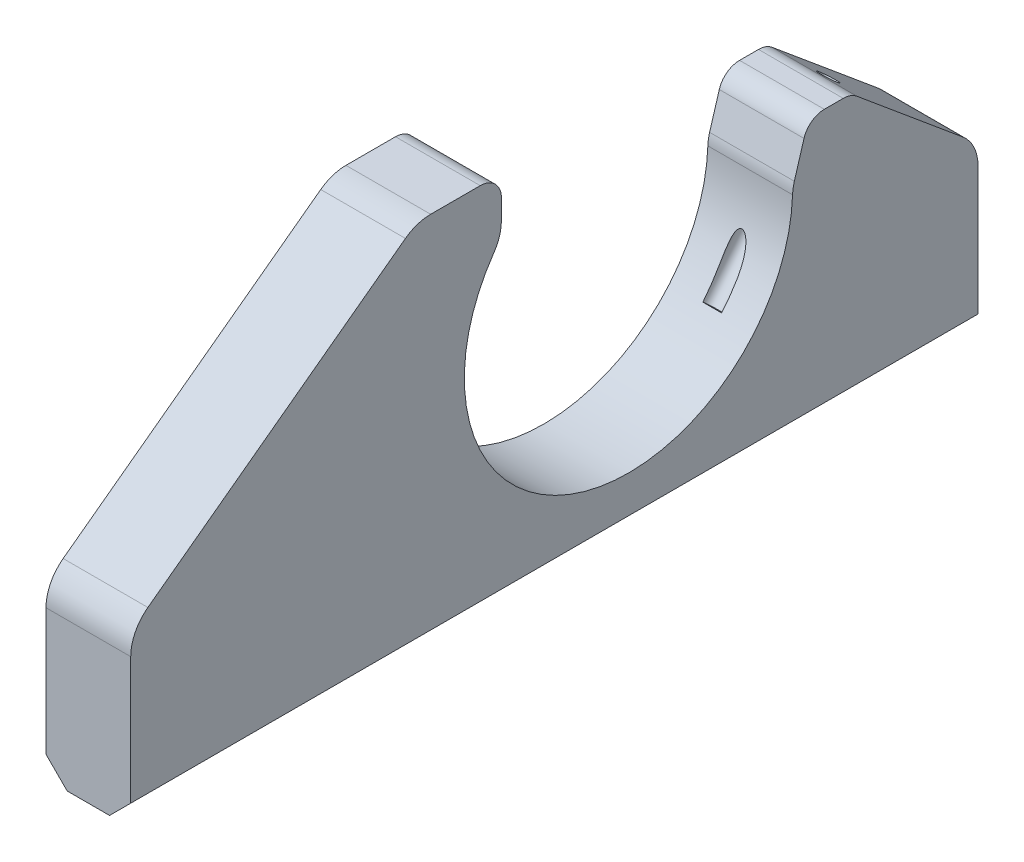
ISO-10303-21;
HEADER;
FILE_DESCRIPTION(('STEP AP214'),'2;1');
FILE_NAME('part.step','',(''),(''),'','','');
FILE_SCHEMA(('AUTOMOTIVE_DESIGN { 1 0 10303 214 1 1 1 1 }'));
ENDSEC;
DATA;
#1=APPLICATION_CONTEXT('core data for automotive mechanical design processes');
#2=APPLICATION_PROTOCOL_DEFINITION('international standard','automotive_design',2000,#1);
#3=PRODUCT_CONTEXT('',#1,'mechanical');
#4=PRODUCT('Part','Part','',(#3));
#5=PRODUCT_RELATED_PRODUCT_CATEGORY('part','',(#4));
#6=PRODUCT_DEFINITION_FORMATION('','',#4);
#7=PRODUCT_DEFINITION_CONTEXT('part definition',#1,'design');
#8=PRODUCT_DEFINITION('design','',#6,#7);
#9=PRODUCT_DEFINITION_SHAPE('','',#8);
#10=(LENGTH_UNIT() NAMED_UNIT(*) SI_UNIT(.MILLI.,.METRE.));
#11=(NAMED_UNIT(*) PLANE_ANGLE_UNIT() SI_UNIT($,.RADIAN.));
#12=(NAMED_UNIT(*) SI_UNIT($,.STERADIAN.) SOLID_ANGLE_UNIT());
#13=UNCERTAINTY_MEASURE_WITH_UNIT(LENGTH_MEASURE(1.E-05),#10,'distance_accuracy_value','');
#14=(GEOMETRIC_REPRESENTATION_CONTEXT(3) GLOBAL_UNCERTAINTY_ASSIGNED_CONTEXT((#13)) GLOBAL_UNIT_ASSIGNED_CONTEXT((#10,
#11,#12)) REPRESENTATION_CONTEXT('',''));
#15=CARTESIAN_POINT('',(0.,0.,0.));
#16=DIRECTION('',(0.,0.,1.));
#17=DIRECTION('',(1.,0.,0.));
#18=AXIS2_PLACEMENT_3D('',#15,#16,#17);
#19=CARTESIAN_POINT('',(20.,-25.,-165.));
#20=DIRECTION('',(0.,-0.768221279597376,0.64018439966448));
#21=DIRECTION('',(0.,-0.64018439966448,-0.768221279597376));
#22=AXIS2_PLACEMENT_3D('',#19,#20,#21);
#23=PLANE('',#22);
#24=DIRECTION('',(0.,0.64018439966448,0.768221279597376));
#25=VECTOR('',#24,1.);
#26=CARTESIAN_POINT('',(20.,-25.,-165.));
#27=LINE('',#26,#25);
#28=CARTESIAN_POINT('',(20.,-19.0030733277413,-157.80368799329));
#29=VERTEX_POINT('',#28);
#30=CARTESIAN_POINT('',(20.,22.6822127959738,-107.781344644831));
#31=VERTEX_POINT('',#30);
#32=EDGE_CURVE('E359',#29,#31,#27,.T.);
#33=ORIENTED_EDGE('',*,*,#32,.F.);
#34=DIRECTION('',(-1.,0.,0.));
#35=VECTOR('',#34,1.);
#36=CARTESIAN_POINT('',(20.,-19.0030733277413,-157.80368799329));
#37=LINE('',#36,#35);
#38=CARTESIAN_POINT('',(-20.,-19.0030733277413,-157.80368799329));
#39=VERTEX_POINT('',#38);
#40=EDGE_CURVE('E279',#29,#39,#37,.T.);
#41=ORIENTED_EDGE('',*,*,#40,.T.);
#42=DIRECTION('',(0.,0.64018439966448,0.768221279597376));
#43=VECTOR('',#42,1.);
#44=CARTESIAN_POINT('',(-20.,-25.,-165.));
#45=LINE('',#44,#43);
#46=CARTESIAN_POINT('',(-20.,22.6822127959738,-107.781344644831));
#47=VERTEX_POINT('',#46);
#48=EDGE_CURVE('E315',#39,#47,#45,.T.);
#49=ORIENTED_EDGE('',*,*,#48,.T.);
#50=DIRECTION('',(-1.,0.,0.));
#51=VECTOR('',#50,1.);
#52=CARTESIAN_POINT('',(20.,22.6822127959738,-107.781344644831));
#53=LINE('',#52,#51);
#54=EDGE_CURVE('E234',#47,#31,#53,.F.);
#55=ORIENTED_EDGE('',*,*,#54,.T.);
#56=EDGE_LOOP('',(#33,#41,#49,#55));
#57=FACE_BOUND('',#56,.T.);
#58=CARTESIAN_POINT('',(0.,17.3177872040262,-114.218655355169));
#59=DIRECTION('',(0.,0.768221279597376,-0.64018439966448));
#60=DIRECTION('',(0.,0.64018439966448,0.768221279597376));
#61=AXIS2_PLACEMENT_3D('',#58,#59,#60);
#62=CIRCLE('',#61,4.49999999999999);
#63=CARTESIAN_POINT('',(0.,20.1986170025164,-110.76165959698));
#64=VERTEX_POINT('',#63);
#65=EDGE_CURVE('E196',#64,#64,#62,.T.);
#66=ORIENTED_EDGE('',*,*,#65,.F.);
#67=EDGE_LOOP('',(#66));
#68=FACE_BOUND('',#67,.T.);
#69=ADVANCED_FACE('F36',(#57,#68),#23,.F.);
#70=CARTESIAN_POINT('',(20.,-105.,235.));
#71=DIRECTION('',(0.,0.,-1.));
#72=DIRECTION('',(-1.,0.,0.));
#73=AXIS2_PLACEMENT_3D('',#70,#71,#72);
#74=PLANE('',#73);
#75=DIRECTION('',(0.,-1.,0.));
#76=VECTOR('',#75,1.);
#77=CARTESIAN_POINT('',(-20.,-105.,235.));
#78=LINE('',#77,#76);
#79=CARTESIAN_POINT('',(-20.,-35.0745149872762,235.));
#80=VERTEX_POINT('',#79);
#81=CARTESIAN_POINT('',(-20.,-94.9999999999999,235.));
#82=VERTEX_POINT('',#81);
#83=EDGE_CURVE('E195',#80,#82,#78,.T.);
#84=ORIENTED_EDGE('',*,*,#83,.T.);
#85=DIRECTION('',(-0.707106781186546,0.707106781186549,0.));
#86=VECTOR('',#85,1.);
#87=CARTESIAN_POINT('',(-9.99999999999993,-105.,235.));
#88=LINE('',#87,#86);
#89=CARTESIAN_POINT('',(-9.99999999999993,-105.,235.));
#90=VERTEX_POINT('',#89);
#91=EDGE_CURVE('E44',#82,#90,#88,.F.);
#92=ORIENTED_EDGE('',*,*,#91,.T.);
#93=DIRECTION('',(-1.,0.,0.));
#94=VECTOR('',#93,1.);
#95=CARTESIAN_POINT('',(20.,-105.,235.));
#96=LINE('',#95,#94);
#97=CARTESIAN_POINT('',(9.99999999999993,-105.,235.));
#98=VERTEX_POINT('',#97);
#99=EDGE_CURVE('E191',#98,#90,#96,.T.);
#100=ORIENTED_EDGE('',*,*,#99,.F.);
#101=DIRECTION('',(0.707106781186549,0.707106781186546,0.));
#102=VECTOR('',#101,1.);
#103=CARTESIAN_POINT('',(20.,-95.,235.));
#104=LINE('',#103,#102);
#105=CARTESIAN_POINT('',(20.,-95.,235.));
#106=VERTEX_POINT('',#105);
#107=EDGE_CURVE('E51',#98,#106,#104,.T.);
#108=ORIENTED_EDGE('',*,*,#107,.T.);
#109=DIRECTION('',(0.,-1.,0.));
#110=VECTOR('',#109,1.);
#111=CARTESIAN_POINT('',(20.,-105.,235.));
#112=LINE('',#111,#110);
#113=CARTESIAN_POINT('',(20.,-35.0745149872762,235.));
#114=VERTEX_POINT('',#113);
#115=EDGE_CURVE('E338',#114,#106,#112,.T.);
#116=ORIENTED_EDGE('',*,*,#115,.F.);
#117=DIRECTION('',(-1.,0.,0.));
#118=VECTOR('',#117,1.);
#119=CARTESIAN_POINT('',(20.,-35.0745149872762,235.));
#120=LINE('',#119,#118);
#121=EDGE_CURVE('E240',#114,#80,#120,.T.);
#122=ORIENTED_EDGE('',*,*,#121,.T.);
#123=EDGE_LOOP('',(#84,#92,#100,#108,#116,#122));
#124=FACE_BOUND('',#123,.T.);
#125=ADVANCED_FACE('F299',(#124),#74,.F.);
#126=CARTESIAN_POINT('',(20.,-105.,235.));
#127=DIRECTION('',(0.,1.,0.));
#128=DIRECTION('',(0.,0.,1.));
#129=AXIS2_PLACEMENT_3D('',#126,#127,#128);
#130=PLANE('',#129);
#131=ORIENTED_EDGE('',*,*,#99,.T.);
#132=DIRECTION('',(0.,0.,-1.));
#133=VECTOR('',#132,1.);
#134=CARTESIAN_POINT('',(-9.99999999999993,-105.,235.));
#135=LINE('',#134,#133);
#136=CARTESIAN_POINT('',(-9.99999999999993,-105.,-165.));
#137=VERTEX_POINT('',#136);
#138=EDGE_CURVE('E289',#90,#137,#135,.T.);
#139=ORIENTED_EDGE('',*,*,#138,.T.);
#140=DIRECTION('',(-1.,0.,0.));
#141=VECTOR('',#140,1.);
#142=CARTESIAN_POINT('',(20.,-105.,-165.));
#143=LINE('',#142,#141);
#144=CARTESIAN_POINT('',(9.99999999999993,-105.,-165.));
#145=VERTEX_POINT('',#144);
#146=EDGE_CURVE('E307',#145,#137,#143,.T.);
#147=ORIENTED_EDGE('',*,*,#146,.F.);
#148=DIRECTION('',(0.,0.,1.));
#149=VECTOR('',#148,1.);
#150=CARTESIAN_POINT('',(9.99999999999993,-105.,235.));
#151=LINE('',#150,#149);
#152=EDGE_CURVE('E287',#145,#98,#151,.T.);
#153=ORIENTED_EDGE('',*,*,#152,.T.);
#154=EDGE_LOOP('',(#131,#139,#147,#153));
#155=FACE_BOUND('',#154,.T.);
#156=ADVANCED_FACE('F303',(#155),#130,.F.);
#157=CARTESIAN_POINT('',(20.,-105.,-165.));
#158=DIRECTION('',(0.,0.,1.));
#159=DIRECTION('',(0.,-1.,0.));
#160=AXIS2_PLACEMENT_3D('',#157,#158,#159);
#161=PLANE('',#160);
#162=ORIENTED_EDGE('',*,*,#146,.T.);
#163=DIRECTION('',(0.707106781186546,-0.707106781186549,0.));
#164=VECTOR('',#163,1.);
#165=CARTESIAN_POINT('',(-10.,-105.,-165.));
#166=LINE('',#165,#164);
#167=CARTESIAN_POINT('',(-20.,-94.9999999999999,-165.));
#168=VERTEX_POINT('',#167);
#169=EDGE_CURVE('E294',#137,#168,#166,.F.);
#170=ORIENTED_EDGE('',*,*,#169,.T.);
#171=DIRECTION('',(0.,1.,0.));
#172=VECTOR('',#171,1.);
#173=CARTESIAN_POINT('',(-20.,-105.,-165.));
#174=LINE('',#173,#172);
#175=CARTESIAN_POINT('',(-20.,-34.3674989196888,-165.));
#176=VERTEX_POINT('',#175);
#177=EDGE_CURVE('E311',#168,#176,#174,.T.);
#178=ORIENTED_EDGE('',*,*,#177,.T.);
#179=DIRECTION('',(-1.,0.,0.));
#180=VECTOR('',#179,1.);
#181=CARTESIAN_POINT('',(20.,-34.3674989196888,-165.));
#182=LINE('',#181,#180);
#183=CARTESIAN_POINT('',(20.,-34.3674989196888,-165.));
#184=VERTEX_POINT('',#183);
#185=EDGE_CURVE('E282',#176,#184,#182,.F.);
#186=ORIENTED_EDGE('',*,*,#185,.T.);
#187=DIRECTION('',(0.,1.,0.));
#188=VECTOR('',#187,1.);
#189=CARTESIAN_POINT('',(20.,-105.,-165.));
#190=LINE('',#189,#188);
#191=CARTESIAN_POINT('',(20.,-95.,-165.));
#192=VERTEX_POINT('',#191);
#193=EDGE_CURVE('E361',#192,#184,#190,.T.);
#194=ORIENTED_EDGE('',*,*,#193,.F.);
#195=DIRECTION('',(-0.707106781186549,-0.707106781186546,0.));
#196=VECTOR('',#195,1.);
#197=CARTESIAN_POINT('',(20.,-95.,-165.));
#198=LINE('',#197,#196);
#199=EDGE_CURVE('E292',#192,#145,#198,.T.);
#200=ORIENTED_EDGE('',*,*,#199,.T.);
#201=EDGE_LOOP('',(#162,#170,#178,#186,#194,#200));
#202=FACE_BOUND('',#201,.T.);
#203=ADVANCED_FACE('F310',(#202),#161,.F.);
#204=CARTESIAN_POINT('',(20.,25.,-105.));
#205=DIRECTION('',(0.,-1.,0.));
#206=DIRECTION('',(0.,0.,-1.));
#207=AXIS2_PLACEMENT_3D('',#204,#205,#206);
#208=PLANE('',#207);
#209=DIRECTION('',(0.,0.,1.));
#210=VECTOR('',#209,1.);
#211=CARTESIAN_POINT('',(20.,25.,-105.));
#212=LINE('',#211,#210);
#213=CARTESIAN_POINT('',(20.,25.,-101.379500648187));
#214=VERTEX_POINT('',#213);
#215=CARTESIAN_POINT('',(20.,25.,-92.4403065089106));
#216=VERTEX_POINT('',#215);
#217=EDGE_CURVE('E356',#214,#216,#212,.T.);
#218=ORIENTED_EDGE('',*,*,#217,.F.);
#219=DIRECTION('',(-1.,0.,0.));
#220=VECTOR('',#219,1.);
#221=CARTESIAN_POINT('',(20.,25.,-101.379500648187));
#222=LINE('',#221,#220);
#223=CARTESIAN_POINT('',(-20.,25.,-101.379500648187));
#224=VERTEX_POINT('',#223);
#225=EDGE_CURVE('E231',#214,#224,#222,.T.);
#226=ORIENTED_EDGE('',*,*,#225,.T.);
#227=DIRECTION('',(0.,0.,1.));
#228=VECTOR('',#227,1.);
#229=CARTESIAN_POINT('',(-20.,25.,-105.));
#230=LINE('',#229,#228);
#231=CARTESIAN_POINT('',(-20.,25.,-92.4403065089106));
#232=VERTEX_POINT('',#231);
#233=EDGE_CURVE('E317',#224,#232,#230,.T.);
#234=ORIENTED_EDGE('',*,*,#233,.T.);
#235=DIRECTION('',(-1.,0.,0.));
#236=VECTOR('',#235,1.);
#237=CARTESIAN_POINT('',(20.,25.,-92.4403065089106));
#238=LINE('',#237,#236);
#239=EDGE_CURVE('E229',#232,#216,#238,.F.);
#240=ORIENTED_EDGE('',*,*,#239,.T.);
#241=EDGE_LOOP('',(#218,#226,#234,#240));
#242=FACE_BOUND('',#241,.T.);
#243=ADVANCED_FACE('F377',(#242),#208,.F.);
#244=CARTESIAN_POINT('',(20.,25.,-85.));
#245=DIRECTION('',(0.,-0.287347885566346,-0.957826285221151));
#246=DIRECTION('',(0.,0.957826285221151,-0.287347885566346));
#247=AXIS2_PLACEMENT_3D('',#244,#245,#246);
#248=PLANE('',#247);
#249=DIRECTION('',(0.,-0.957826285221151,0.287347885566346));
#250=VECTOR('',#249,1.);
#251=CARTESIAN_POINT('',(-20.,25.,-85.));
#252=LINE('',#251,#250);
#253=CARTESIAN_POINT('',(-20.,17.8734788556635,-82.8620436566991));
#254=VERTEX_POINT('',#253);
#255=CARTESIAN_POINT('',(-20.,2.64730250173201,-78.2941907505197));
#256=VERTEX_POINT('',#255);
#257=EDGE_CURVE('E324',#254,#256,#252,.T.);
#258=ORIENTED_EDGE('',*,*,#257,.T.);
#259=DIRECTION('',(-1.,0.,0.));
#260=VECTOR('',#259,1.);
#261=CARTESIAN_POINT('',(20.,2.64730250173201,-78.2941907505197));
#262=LINE('',#261,#260);
#263=CARTESIAN_POINT('',(20.,2.64730250173201,-78.2941907505197));
#264=VERTEX_POINT('',#263);
#265=EDGE_CURVE('E285',#256,#264,#262,.F.);
#266=ORIENTED_EDGE('',*,*,#265,.T.);
#267=DIRECTION('',(0.,-0.957826285221151,0.287347885566346));
#268=VECTOR('',#267,1.);
#269=CARTESIAN_POINT('',(20.,25.,-85.));
#270=LINE('',#269,#268);
#271=CARTESIAN_POINT('',(20.,17.8734788556635,-82.8620436566991));
#272=VERTEX_POINT('',#271);
#273=EDGE_CURVE('E353',#272,#264,#270,.T.);
#274=ORIENTED_EDGE('',*,*,#273,.F.);
#275=DIRECTION('',(-1.,0.,0.));
#276=VECTOR('',#275,1.);
#277=CARTESIAN_POINT('',(20.,17.8734788556635,-82.8620436566991));
#278=LINE('',#277,#276);
#279=EDGE_CURVE('E237',#272,#254,#278,.T.);
#280=ORIENTED_EDGE('',*,*,#279,.T.);
#281=EDGE_LOOP('',(#258,#266,#274,#280));
#282=FACE_BOUND('',#281,.T.);
#283=ADVANCED_FACE('F439',(#282),#248,.F.);
#284=CARTESIAN_POINT('',(20.,0.,0.));
#285=DIRECTION('',(-1.,0.,0.));
#286=DIRECTION('',(0.,0.,1.));
#287=AXIS2_PLACEMENT_3D('',#284,#285,#286);
#288=CYLINDRICAL_SURFACE('',#287,77.5);
#289=CARTESIAN_POINT('',(-4.42064328381064,-49.6142909739972,-59.5371491687966));
#290=CARTESIAN_POINT('',(-4.42063223439587,-49.3258877645143,-59.7774854526784));
#291=CARTESIAN_POINT('',(-4.42116218208857,-49.035738401147,-60.0157254754635));
#292=CARTESIAN_POINT('',(-4.42322373057201,-48.4520114345749,-60.4879617376993));
#293=CARTESIAN_POINT('',(-4.42475532825368,-48.1584338420141,-60.7219579903201));
#294=CARTESIAN_POINT('',(-4.42873982652362,-47.5679141763734,-61.1856557795448));
#295=CARTESIAN_POINT('',(-4.43119272248587,-47.2709721201944,-61.4153573377072));
#296=CARTESIAN_POINT('',(-4.43685740657448,-46.6737881794937,-61.8704164248569));
#297=CARTESIAN_POINT('',(-4.44006919546906,-46.3735462916319,-62.0957739494466));
#298=CARTESIAN_POINT('',(-4.45055441771913,-45.4665271708848,-62.7663225356267));
#299=CARTESIAN_POINT('',(-4.45866650432388,-44.8548484276277,-63.2048965388281));
#300=CARTESIAN_POINT('',(-4.47471513100481,-43.6189821836077,-64.064036421948));
#301=CARTESIAN_POINT('',(-4.48265167309289,-42.9947948263607,-64.4846025083045));
#302=CARTESIAN_POINT('',(-4.49244199680447,-41.9944458687961,-65.1376384983351));
#303=CARTESIAN_POINT('',(-4.4954544204643,-41.6222084905466,-65.3761209714467));
#304=CARTESIAN_POINT('',(-4.49942684946549,-40.8737012728814,-65.8466852487549));
#305=CARTESIAN_POINT('',(-4.50038688453548,-40.497431491954,-66.0787671456152));
#306=CARTESIAN_POINT('',(-4.4993247313951,-39.7408991935622,-66.536504557196));
#307=CARTESIAN_POINT('',(-4.49730192542122,-39.3606358652068,-66.7621587308314));
#308=CARTESIAN_POINT('',(-4.48921135393556,-38.5963428378235,-67.2069028897369));
#309=CARTESIAN_POINT('',(-4.48314370526273,-38.2123132479033,-67.425993064423));
#310=CARTESIAN_POINT('',(-4.46576056006467,-37.4409718701168,-67.8573409091116));
#311=CARTESIAN_POINT('',(-4.45444948101797,-37.0536631140066,-68.0696041699811));
#312=CARTESIAN_POINT('',(-4.42518953262511,-36.2756786880118,-68.4873715979512));
#313=CARTESIAN_POINT('',(-4.40724094982016,-35.8850031641816,-68.6928760564125));
#314=CARTESIAN_POINT('',(-4.3630831355172,-35.100693795009,-69.0969306320539));
#315=CARTESIAN_POINT('',(-4.33687674650837,-34.7070610130539,-69.2954831161401));
#316=CARTESIAN_POINT('',(-4.27425595592277,-33.9171351076044,-69.6855217255223));
#317=CARTESIAN_POINT('',(-4.23784238539796,-33.5208422032556,-69.8770084246672));
#318=CARTESIAN_POINT('',(-4.15233683212676,-32.725486280476,-70.2530167768276));
#319=CARTESIAN_POINT('',(-4.10322377420339,-32.3264197407404,-70.437526261888));
#320=CARTESIAN_POINT('',(-3.98927986073676,-31.5269091144921,-70.7989859935073));
#321=CARTESIAN_POINT('',(-3.92444503506321,-31.1264647052534,-70.9759343173919));
#322=CARTESIAN_POINT('',(-3.81230219005366,-30.5258301311945,-71.2353237361862));
#323=CARTESIAN_POINT('',(-3.77242373651436,-30.325557365319,-71.3208087823248));
#324=CARTESIAN_POINT('',(-3.6870300467838,-29.9253276471309,-71.4896630158568));
#325=CARTESIAN_POINT('',(-3.64151518618602,-29.725370674673,-71.5730323437897));
#326=CARTESIAN_POINT('',(-3.54408662312453,-29.3262016013118,-71.7375109241284));
#327=CARTESIAN_POINT('',(-3.4921761531379,-29.1269891761314,-71.8186212930505));
#328=CARTESIAN_POINT('',(-3.38097661076846,-28.7296920506679,-71.9784733835246));
#329=CARTESIAN_POINT('',(-3.32168846298377,-28.5316072123186,-72.0572154003545));
#330=CARTESIAN_POINT('',(-3.1941986448062,-28.1361864714919,-72.212535968651));
#331=CARTESIAN_POINT('',(-3.12595348472764,-27.938859398961,-72.2891015906295));
#332=CARTESIAN_POINT('',(-2.97918449326893,-27.5468367040748,-72.4393943179283));
#333=CARTESIAN_POINT('',(-2.90065711422824,-27.3521420156648,-72.5131204321223));
#334=CARTESIAN_POINT('',(-2.73161291245189,-26.9676597132034,-72.6569837246079));
#335=CARTESIAN_POINT('',(-2.64114552908005,-26.7778555262691,-72.7271341325125));
#336=CARTESIAN_POINT('',(-2.44529958480708,-26.4046985883348,-72.8634422728918));
#337=CARTESIAN_POINT('',(-2.33993533569647,-26.2213398537168,-72.929603751606));
#338=CARTESIAN_POINT('',(-2.14063803283769,-25.9116503175357,-73.0400978282845));
#339=CARTESIAN_POINT('',(-2.05098412014308,-25.7830017646701,-73.0855958045049));
#340=CARTESIAN_POINT('',(-1.85928891391285,-25.5334965624391,-73.173137265876));
#341=CARTESIAN_POINT('',(-1.75722775322377,-25.4126528972559,-73.2151750249587));
#342=CARTESIAN_POINT('',(-1.53731878644118,-25.1817869209003,-73.294901968513));
#343=CARTESIAN_POINT('',(-1.41931526037342,-25.0718927458815,-73.332540392752));
#344=CARTESIAN_POINT('',(-1.1660477176065,-24.871413764512,-73.4007759848755));
#345=CARTESIAN_POINT('',(-1.03084187689416,-24.7807665047605,-73.4313959531563));
#346=CARTESIAN_POINT('',(-0.797760367872305,-24.6580644005075,-73.4726640844761));
#347=CARTESIAN_POINT('',(-0.705307803265684,-24.6168473751052,-73.4864756915962));
#348=CARTESIAN_POINT('',(-0.514656583202884,-24.5488060353631,-73.5092335136322));
#349=CARTESIAN_POINT('',(-0.416464628317794,-24.5219652951911,-73.5181852813873));
#350=CARTESIAN_POINT('',(-0.21576141876568,-24.4851418936219,-73.5304578452407));
#351=CARTESIAN_POINT('',(-0.113223022066944,-24.4752888240691,-73.5337353555793));
#352=CARTESIAN_POINT('',(0.0919857178027263,-24.4740327969327,-73.5341534333862));
#353=CARTESIAN_POINT('',(0.194656054464323,-24.4826289616202,-73.5312942928076));
#354=CARTESIAN_POINT('',(0.387413653447475,-24.5156395854677,-73.5202942310873));
#355=CARTESIAN_POINT('',(0.477797930900007,-24.53854960752,-73.5126555548598));
#356=CARTESIAN_POINT('',(0.653954546438842,-24.5967777491929,-73.493193327242));
#357=CARTESIAN_POINT('',(0.739724517630437,-24.6321021680699,-73.4813676512808));
#358=CARTESIAN_POINT('',(0.952370468437,-24.7355644639345,-73.44662160153));
#359=CARTESIAN_POINT('',(1.07527272593243,-24.8109883202687,-73.4212004955392));
#360=CARTESIAN_POINT('',(1.30736343331986,-24.9787712797184,-73.3642887022988));
#361=CARTESIAN_POINT('',(1.4165098990431,-25.0711802092895,-73.3327801429592));
#362=CARTESIAN_POINT('',(1.61133221263475,-25.2568694266049,-73.2690190795921));
#363=CARTESIAN_POINT('',(1.69826977859667,-25.349001680386,-73.2372057619323));
#364=CARTESIAN_POINT('',(1.86353546297131,-25.5398483428752,-73.1708710075939));
#365=CARTESIAN_POINT('',(1.94185621077163,-25.6385682723426,-73.1363472950999));
#366=CARTESIAN_POINT('',(2.09111592409917,-25.8409418947543,-73.065089199301));
#367=CARTESIAN_POINT('',(2.16204054574754,-25.9446046266916,-73.0283507306716));
#368=CARTESIAN_POINT('',(2.29731278830659,-26.155432598979,-72.9531074107178));
#369=CARTESIAN_POINT('',(2.36166250030271,-26.2625967113493,-72.9146031266738));
#370=CARTESIAN_POINT('',(2.51004692606179,-26.5243911400148,-72.8198683111174));
#371=CARTESIAN_POINT('',(2.59124188993133,-26.680353984949,-72.7628817805031));
#372=CARTESIAN_POINT('',(2.74413924458365,-26.9959793581916,-72.6463725291208));
#373=CARTESIAN_POINT('',(2.81583724529767,-27.1556435576959,-72.5868486521272));
#374=CARTESIAN_POINT('',(2.95124781967097,-27.4777856330088,-72.4655157372496));
#375=CARTESIAN_POINT('',(3.01494741109696,-27.6402676081256,-72.4037031898794));
#376=CARTESIAN_POINT('',(3.13536568885489,-27.9670508090521,-72.2781067879273));
#377=CARTESIAN_POINT('',(3.19208360285012,-28.1313522339482,-72.2143227162234));
#378=CARTESIAN_POINT('',(3.29970069419957,-28.4620342676637,-72.084632945551));
#379=CARTESIAN_POINT('',(3.35056967098492,-28.6284211432217,-72.0187183055068));
#380=CARTESIAN_POINT('',(3.44690872117865,-28.9620715840066,-71.8851911182319));
#381=CARTESIAN_POINT('',(3.49237864364425,-29.1293351736076,-71.817578523595));
#382=CARTESIAN_POINT('',(3.57848780028409,-29.4642574026028,-71.6808218474475));
#383=CARTESIAN_POINT('',(3.61913204127896,-29.6319154451917,-71.6116794431449));
#384=CARTESIAN_POINT('',(3.69615566995861,-29.9675681783944,-71.4718680100906));
#385=CARTESIAN_POINT('',(3.73253505843603,-30.1355628689456,-71.4011989816227));
#386=CARTESIAN_POINT('',(3.82451390584329,-30.5840679871616,-71.2106564417144));
#387=CARTESIAN_POINT('',(3.87670506446749,-30.8647225150642,-71.0894700211783));
#388=CARTESIAN_POINT('',(3.97211581489585,-31.4258618554054,-70.8432009844557));
#389=CARTESIAN_POINT('',(4.01533434483514,-31.7063466438442,-70.7181179091321));
#390=CARTESIAN_POINT('',(4.09413348033107,-32.2668190812362,-70.4641545868399));
#391=CARTESIAN_POINT('',(4.12971057798387,-32.5468064435983,-70.3352726266838));
#392=CARTESIAN_POINT('',(4.19428298811875,-33.1058298084767,-70.0738843152767));
#393=CARTESIAN_POINT('',(4.22327839146182,-33.384865824074,-69.9413780140885));
#394=CARTESIAN_POINT('',(4.30189835684308,-34.2212881679405,-69.5380259330145));
#395=CARTESIAN_POINT('',(4.34301254733638,-34.776908817833,-69.2618361377995));
#396=CARTESIAN_POINT('',(4.40844650311766,-35.8821315202024,-68.6957661120846));
#397=CARTESIAN_POINT('',(4.43276450758109,-36.4317329357119,-68.4058844496031));
#398=CARTESIAN_POINT('',(4.45998787844411,-37.2512546481019,-67.9609504928667));
#399=CARTESIAN_POINT('',(4.46752148021818,-37.5237472483344,-67.8108780419466));
#400=CARTESIAN_POINT('',(4.47996051560985,-38.0669301750118,-67.5074484577572));
#401=CARTESIAN_POINT('',(4.48486615252194,-38.3376206392663,-67.3540915795197));
#402=CARTESIAN_POINT('',(4.49630633889271,-39.1469692837208,-66.8891023893294));
#403=CARTESIAN_POINT('',(4.49956308666402,-39.6828687151031,-66.5725710669871));
#404=CARTESIAN_POINT('',(4.50035360453184,-40.7462934703357,-65.927051085498));
#405=CARTESIAN_POINT('',(4.49789362189735,-41.273827301764,-65.598076411036));
#406=CARTESIAN_POINT('',(4.4897584139022,-42.3207841496757,-64.9275568426811));
#407=CARTESIAN_POINT('',(4.4840833315845,-42.840207525945,-64.5860125086567));
#408=CARTESIAN_POINT('',(4.47126543670978,-43.8976034067932,-63.8723589959792));
#409=CARTESIAN_POINT('',(4.46406142147072,-44.4351267546988,-63.4995852832483));
#410=CARTESIAN_POINT('',(4.45030979887536,-45.5006366600443,-62.7404973332324));
#411=CARTESIAN_POINT('',(4.44376227645029,-46.028621976313,-62.3541813526711));
#412=CARTESIAN_POINT('',(4.43275550433862,-47.0721770579917,-61.5701553572331));
#413=CARTESIAN_POINT('',(4.42828647927339,-47.5877938985186,-61.1725082086148));
#414=CARTESIAN_POINT('',(4.42374091239954,-48.3535477303723,-60.5664130327498));
#415=CARTESIAN_POINT('',(4.42258538885685,-48.6075086116865,-60.3627870856597));
#416=CARTESIAN_POINT('',(4.42103422928401,-49.1128466943491,-59.952349779417));
#417=CARTESIAN_POINT('',(4.42063859544708,-49.3642238882385,-59.7455384110723));
#418=CARTESIAN_POINT('',(4.42064328381067,-49.6142909739972,-59.5371491687966));
#419=B_SPLINE_CURVE_WITH_KNOTS('',3,(#289,#290,#291,#292,#293,#294,#295,#296,#297,#298,#299,
#300,#301,#302,#303,#304,#305,#306,#307,#308,#309,#310,#311,#312,#313,#314,#315,#316,#317,#318,
#319,#320,#321,#322,#323,#324,#325,#326,#327,#328,#329,#330,#331,#332,#333,#334,#335,#336,#337,
#338,#339,#340,#341,#342,#343,#344,#345,#346,#347,#348,#349,#350,#351,#352,#353,#354,#355,#356,
#357,#358,#359,#360,#361,#362,#363,#364,#365,#366,#367,#368,#369,#370,#371,#372,#373,#374,#375,
#376,#377,#378,#379,#380,#381,#382,#383,#384,#385,#386,#387,#388,#389,#390,#391,#392,#393,#394,
#395,#396,#397,#398,#399,#400,#401,#402,#403,#404,#405,#406,#407,#408,#409,#410,#411,#412,#413,
#414,#415,#416,#417,#418),.UNSPECIFIED.,.F.,.F.,(4,2,2,2,2,2,2,2,2,2,2,2,2,2,2,2,2,2,2,2,2,2,2,
2,2,2,2,2,2,2,2,2,2,2,2,2,2,2,2,2,2,2,2,2,2,2,2,2,2,2,2,2,2,2,2,2,2,2,2,2,2,2,2,2,4),(0.,
1.12623974534927,2.25247599491372,3.37870658948617,4.50493832413167,6.76270933936834,
9.02045446519076,10.3466643706532,11.6728550659691,12.9993204615696,14.325747542671,
15.6510591624344,16.9763135751372,18.3011123082369,19.625803209713,20.9527067440214,
22.2799457034592,22.944006903044,23.6080238753455,24.2717066056045,24.9353062442762,
25.6022561347345,26.2694367514149,26.933936741705,27.597802614359,28.0871079001595,
28.5772072715792,29.072496268905,29.5661526985633,29.8715812099866,30.1766600011791,
30.4840559798338,30.7914373343397,31.0709568616475,31.3506184267445,31.7873757641211,
32.2254354123471,32.616690431953,33.0082775612476,33.400610529198,33.7928183285417,
34.3469327982163,34.9013025256755,35.4565607295172,36.0118803027976,36.5699494122479,
37.1280341201099,37.6855346388505,38.243035053978,39.1732102954812,40.103495555812,
41.0342069678281,41.9649055304921,43.8298822489551,45.695054452186,46.6285542730469,
47.5619818696562,49.4289599519212,51.2938987516086,53.1587545848426,55.1210642873622,
57.0836275294989,59.0368649040988,60.0133912669174,60.9899204482039),.UNSPECIFIED.);
#420=CARTESIAN_POINT('',(-4.42064328381064,-49.6142909739972,-59.5371491687966));
#421=VERTEX_POINT('',#420);
#422=CARTESIAN_POINT('',(4.42064328381064,-49.6142909739972,-59.5371491687966));
#423=VERTEX_POINT('',#422);
#424=EDGE_CURVE('E182',#421,#423,#419,.T.);
#425=ORIENTED_EDGE('',*,*,#424,.T.);
#426=DIRECTION('',(-1.,0.,0.));
#427=VECTOR('',#426,1.);
#428=CARTESIAN_POINT('',(20.,-49.6142909739972,-59.5371491687966));
#429=LINE('',#428,#427);
#430=EDGE_CURVE('E190',#423,#421,#429,.T.);
#431=ORIENTED_EDGE('',*,*,#430,.T.);
#432=EDGE_LOOP('',(#425,#431));
#433=FACE_BOUND('',#432,.T.);
#434=CARTESIAN_POINT('',(-20.,0.,0.));
#435=DIRECTION('',(-1.,0.,0.));
#436=DIRECTION('',(0.,0.,-1.));
#437=AXIS2_PLACEMENT_3D('',#434,#435,#436);
#438=CIRCLE('',#437,77.5);
#439=CARTESIAN_POINT('',(-20.,-2.4638284999344,-77.4608259000826));
#440=VERTEX_POINT('',#439);
#441=CARTESIAN_POINT('',(-20.,44.3011795575543,63.5897435897437));
#442=VERTEX_POINT('',#441);
#443=EDGE_CURVE('E327',#440,#442,#438,.T.);
#444=ORIENTED_EDGE('',*,*,#443,.T.);
#445=DIRECTION('',(-1.,0.,0.));
#446=VECTOR('',#445,1.);
#447=CARTESIAN_POINT('',(20.,44.3011795575543,63.5897435897437));
#448=LINE('',#447,#446);
#449=CARTESIAN_POINT('',(20.,44.3011795575543,63.5897435897437));
#450=VERTEX_POINT('',#449);
#451=EDGE_CURVE('E275',#442,#450,#448,.F.);
#452=ORIENTED_EDGE('',*,*,#451,.T.);
#453=CARTESIAN_POINT('',(20.,0.,0.));
#454=DIRECTION('',(-1.,0.,0.));
#455=DIRECTION('',(0.,0.,-1.));
#456=AXIS2_PLACEMENT_3D('',#453,#454,#455);
#457=CIRCLE('',#456,77.5);
#458=CARTESIAN_POINT('',(20.,-2.4638284999344,-77.4608259000826));
#459=VERTEX_POINT('',#458);
#460=EDGE_CURVE('E350',#459,#450,#457,.T.);
#461=ORIENTED_EDGE('',*,*,#460,.F.);
#462=DIRECTION('',(-1.,0.,0.));
#463=VECTOR('',#462,1.);
#464=CARTESIAN_POINT('',(20.,-2.4638284999344,-77.4608259000826));
#465=LINE('',#464,#463);
#466=EDGE_CURVE('E272',#459,#440,#465,.T.);
#467=ORIENTED_EDGE('',*,*,#466,.T.);
#468=EDGE_LOOP('',(#444,#452,#461,#467));
#469=FACE_BOUND('',#468,.T.);
#470=ADVANCED_FACE('F198',(#433,#469),#288,.F.);
#471=CARTESIAN_POINT('',(20.,75.,60.0000000000001));
#472=DIRECTION('',(0.,0.,1.));
#473=DIRECTION('',(0.,-1.,0.));
#474=AXIS2_PLACEMENT_3D('',#471,#472,#473);
#475=PLANE('',#474);
#476=DIRECTION('',(0.,1.,0.));
#477=VECTOR('',#476,1.);
#478=CARTESIAN_POINT('',(20.,75.,60.0000000000001));
#479=LINE('',#478,#477);
#480=CARTESIAN_POINT('',(20.,55.7337420240199,60.0000000000001));
#481=VERTEX_POINT('',#480);
#482=CARTESIAN_POINT('',(20.,65.,60.0000000000001));
#483=VERTEX_POINT('',#482);
#484=EDGE_CURVE('E346',#481,#483,#479,.T.);
#485=ORIENTED_EDGE('',*,*,#484,.F.);
#486=DIRECTION('',(-1.,0.,0.));
#487=VECTOR('',#486,1.);
#488=CARTESIAN_POINT('',(20.,55.7337420240199,60.0000000000001));
#489=LINE('',#488,#487);
#490=CARTESIAN_POINT('',(-20.,55.7337420240199,60.0000000000001));
#491=VERTEX_POINT('',#490);
#492=EDGE_CURVE('E269',#481,#491,#489,.T.);
#493=ORIENTED_EDGE('',*,*,#492,.T.);
#494=DIRECTION('',(0.,1.,0.));
#495=VECTOR('',#494,1.);
#496=CARTESIAN_POINT('',(-20.,75.,60.0000000000001));
#497=LINE('',#496,#495);
#498=CARTESIAN_POINT('',(-20.,65.,60.0000000000001));
#499=VERTEX_POINT('',#498);
#500=EDGE_CURVE('E330',#491,#499,#497,.T.);
#501=ORIENTED_EDGE('',*,*,#500,.T.);
#502=DIRECTION('',(-1.,0.,0.));
#503=VECTOR('',#502,1.);
#504=CARTESIAN_POINT('',(20.,65.,60.0000000000001));
#505=LINE('',#504,#503);
#506=EDGE_CURVE('E220',#499,#483,#505,.F.);
#507=ORIENTED_EDGE('',*,*,#506,.T.);
#508=EDGE_LOOP('',(#485,#493,#501,#507));
#509=FACE_BOUND('',#508,.T.);
#510=ADVANCED_FACE('F450',(#509),#475,.F.);
#511=CARTESIAN_POINT('',(20.,75.,100.));
#512=DIRECTION('',(0.,-1.,0.));
#513=DIRECTION('',(0.,0.,-1.));
#514=AXIS2_PLACEMENT_3D('',#511,#512,#513);
#515=PLANE('',#514);
#516=DIRECTION('',(0.,0.,1.));
#517=VECTOR('',#516,1.);
#518=CARTESIAN_POINT('',(-20.,75.,100.));
#519=LINE('',#518,#517);
#520=CARTESIAN_POINT('',(-20.,75.,70.0000000000001));
#521=VERTEX_POINT('',#520);
#522=CARTESIAN_POINT('',(-20.,75.,93.3994047671771));
#523=VERTEX_POINT('',#522);
#524=EDGE_CURVE('E332',#521,#523,#519,.T.);
#525=ORIENTED_EDGE('',*,*,#524,.T.);
#526=DIRECTION('',(-1.,0.,0.));
#527=VECTOR('',#526,1.);
#528=CARTESIAN_POINT('',(20.,75.,93.3994047671771));
#529=LINE('',#528,#527);
#530=CARTESIAN_POINT('',(20.,75.,93.3994047671771));
#531=VERTEX_POINT('',#530);
#532=EDGE_CURVE('E277',#523,#531,#529,.F.);
#533=ORIENTED_EDGE('',*,*,#532,.T.);
#534=DIRECTION('',(0.,0.,1.));
#535=VECTOR('',#534,1.);
#536=CARTESIAN_POINT('',(20.,75.,100.));
#537=LINE('',#536,#535);
#538=CARTESIAN_POINT('',(20.,75.,70.0000000000001));
#539=VERTEX_POINT('',#538);
#540=EDGE_CURVE('E341',#539,#531,#537,.T.);
#541=ORIENTED_EDGE('',*,*,#540,.F.);
#542=DIRECTION('',(-1.,0.,0.));
#543=VECTOR('',#542,1.);
#544=CARTESIAN_POINT('',(20.,75.,70.0000000000001));
#545=LINE('',#544,#543);
#546=EDGE_CURVE('E200',#539,#521,#545,.T.);
#547=ORIENTED_EDGE('',*,*,#546,.T.);
#548=EDGE_LOOP('',(#525,#533,#541,#547));
#549=FACE_BOUND('',#548,.T.);
#550=ADVANCED_FACE('F458',(#549),#515,.F.);
#551=CARTESIAN_POINT('',(20.,-25.,235.));
#552=DIRECTION('',(0.,-0.803557193344746,-0.595227550625738));
#553=DIRECTION('',(0.,0.595227550625738,-0.803557193344746));
#554=AXIS2_PLACEMENT_3D('',#551,#552,#553);
#555=PLANE('',#554);
#556=DIRECTION('',(0.,-0.595227550625738,0.803557193344746));
#557=VECTOR('',#556,1.);
#558=CARTESIAN_POINT('',(-20.,-25.,235.));
#559=LINE('',#558,#557);
#560=CARTESIAN_POINT('',(-20.,71.0711438668949,105.303955779692));
#561=VERTEX_POINT('',#560);
#562=CARTESIAN_POINT('',(-20.,-19.0033711203813,226.904551012515));
#563=VERTEX_POINT('',#562);
#564=EDGE_CURVE('E335',#561,#563,#559,.T.);
#565=ORIENTED_EDGE('',*,*,#564,.T.);
#566=DIRECTION('',(-1.,0.,0.));
#567=VECTOR('',#566,1.);
#568=CARTESIAN_POINT('',(20.,-19.0033711203813,226.904551012515));
#569=LINE('',#568,#567);
#570=CARTESIAN_POINT('',(20.,-19.0033711203813,226.904551012515));
#571=VERTEX_POINT('',#570);
#572=EDGE_CURVE('E257',#563,#571,#569,.F.);
#573=ORIENTED_EDGE('',*,*,#572,.T.);
#574=DIRECTION('',(0.,-0.595227550625738,0.803557193344746));
#575=VECTOR('',#574,1.);
#576=CARTESIAN_POINT('',(20.,-25.,235.));
#577=LINE('',#576,#575);
#578=CARTESIAN_POINT('',(20.,71.0711438668949,105.303955779692));
#579=VERTEX_POINT('',#578);
#580=EDGE_CURVE('E339',#579,#571,#577,.T.);
#581=ORIENTED_EDGE('',*,*,#580,.F.);
#582=DIRECTION('',(-1.,0.,0.));
#583=VECTOR('',#582,1.);
#584=CARTESIAN_POINT('',(20.,71.0711438668949,105.303955779692));
#585=LINE('',#584,#583);
#586=EDGE_CURVE('E254',#579,#561,#585,.T.);
#587=ORIENTED_EDGE('',*,*,#586,.T.);
#588=EDGE_LOOP('',(#565,#573,#581,#587));
#589=FACE_BOUND('',#588,.T.);
#590=ADVANCED_FACE('F463',(#589),#555,.F.);
#591=CARTESIAN_POINT('',(20.,0.,0.));
#592=DIRECTION('',(1.,0.,0.));
#593=DIRECTION('',(0.,0.,-1.));
#594=AXIS2_PLACEMENT_3D('',#591,#592,#593);
#595=PLANE('',#594);
#596=ORIENTED_EDGE('',*,*,#115,.T.);
#597=DIRECTION('',(0.,0.,-1.));
#598=VECTOR('',#597,1.);
#599=CARTESIAN_POINT('',(20.,-95.,-165.));
#600=LINE('',#599,#598);
#601=EDGE_CURVE('E11',#106,#192,#600,.T.);
#602=ORIENTED_EDGE('',*,*,#601,.T.);
#603=ORIENTED_EDGE('',*,*,#193,.T.);
#604=CARTESIAN_POINT('',(20.,-34.3674989196888,-145.));
#605=DIRECTION('',(1.,0.,0.));
#606=DIRECTION('',(0.,0.,-1.));
#607=AXIS2_PLACEMENT_3D('',#604,#605,#606);
#608=CIRCLE('',#607,20.);
#609=EDGE_CURVE('E261',#184,#29,#608,.T.);
#610=ORIENTED_EDGE('',*,*,#609,.T.);
#611=ORIENTED_EDGE('',*,*,#32,.T.);
#612=CARTESIAN_POINT('',(20.,15.,-101.379500648187));
#613=DIRECTION('',(1.,0.,0.));
#614=DIRECTION('',(0.,0.,-1.));
#615=AXIS2_PLACEMENT_3D('',#612,#613,#614);
#616=CIRCLE('',#615,10.);
#617=EDGE_CURVE('E225',#31,#214,#616,.T.);
#618=ORIENTED_EDGE('',*,*,#617,.T.);
#619=ORIENTED_EDGE('',*,*,#217,.T.);
#620=CARTESIAN_POINT('',(20.,15.,-92.4403065089106));
#621=DIRECTION('',(1.,0.,0.));
#622=DIRECTION('',(0.,0.,-1.));
#623=AXIS2_PLACEMENT_3D('',#620,#621,#622);
#624=CIRCLE('',#623,10.);
#625=EDGE_CURVE('E223',#216,#272,#624,.T.);
#626=ORIENTED_EDGE('',*,*,#625,.T.);
#627=ORIENTED_EDGE('',*,*,#273,.T.);
#628=CARTESIAN_POINT('',(20.,-3.0996552095949,-97.4507164549428));
#629=DIRECTION('',(1.,0.,0.));
#630=DIRECTION('',(0.,0.,-1.));
#631=AXIS2_PLACEMENT_3D('',#628,#629,#630);
#632=CIRCLE('',#631,20.);
#633=EDGE_CURVE('E259',#264,#459,#632,.T.);
#634=ORIENTED_EDGE('',*,*,#633,.T.);
#635=ORIENTED_EDGE('',*,*,#460,.T.);
#636=CARTESIAN_POINT('',(20.,55.7337420240199,80.0000000000001));
#637=DIRECTION('',(1.,0.,0.));
#638=DIRECTION('',(0.,0.,-1.));
#639=AXIS2_PLACEMENT_3D('',#636,#637,#638);
#640=CIRCLE('',#639,20.);
#641=EDGE_CURVE('E265',#450,#481,#640,.T.);
#642=ORIENTED_EDGE('',*,*,#641,.T.);
#643=ORIENTED_EDGE('',*,*,#484,.T.);
#644=CARTESIAN_POINT('',(20.,65.,70.0000000000001));
#645=DIRECTION('',(1.,0.,0.));
#646=DIRECTION('',(0.,0.,-1.));
#647=AXIS2_PLACEMENT_3D('',#644,#645,#646);
#648=CIRCLE('',#647,10.);
#649=EDGE_CURVE('E227',#483,#539,#648,.T.);
#650=ORIENTED_EDGE('',*,*,#649,.T.);
#651=ORIENTED_EDGE('',*,*,#540,.T.);
#652=CARTESIAN_POINT('',(20.,55.,93.3994047671771));
#653=DIRECTION('',(1.,0.,0.));
#654=DIRECTION('',(0.,0.,-1.));
#655=AXIS2_PLACEMENT_3D('',#652,#653,#654);
#656=CIRCLE('',#655,20.);
#657=EDGE_CURVE('E263',#531,#579,#656,.T.);
#658=ORIENTED_EDGE('',*,*,#657,.T.);
#659=ORIENTED_EDGE('',*,*,#580,.T.);
#660=CARTESIAN_POINT('',(20.,-35.0745149872762,215.));
#661=DIRECTION('',(1.,0.,0.));
#662=DIRECTION('',(0.,0.,-1.));
#663=AXIS2_PLACEMENT_3D('',#660,#661,#662);
#664=CIRCLE('',#663,20.);
#665=EDGE_CURVE('E267',#571,#114,#664,.T.);
#666=ORIENTED_EDGE('',*,*,#665,.T.);
#667=EDGE_LOOP('',(#596,#602,#603,#610,#611,#618,#619,#626,#627,#634,#635,#642,#643,#650,#651,
#658,#659,#666));
#668=FACE_BOUND('',#667,.T.);
#669=ADVANCED_FACE('F424',(#668),#595,.T.);
#670=CARTESIAN_POINT('',(-20.,0.,0.));
#671=DIRECTION('',(1.,0.,0.));
#672=DIRECTION('',(0.,0.,-1.));
#673=AXIS2_PLACEMENT_3D('',#670,#671,#672);
#674=PLANE('',#673);
#675=ORIENTED_EDGE('',*,*,#177,.F.);
#676=DIRECTION('',(0.,0.,1.));
#677=VECTOR('',#676,1.);
#678=CARTESIAN_POINT('',(-20.,-94.9999999999999,0.));
#679=LINE('',#678,#677);
#680=EDGE_CURVE('E59',#168,#82,#679,.T.);
#681=ORIENTED_EDGE('',*,*,#680,.T.);
#682=ORIENTED_EDGE('',*,*,#83,.F.);
#683=CARTESIAN_POINT('',(-20.,-35.0745149872762,215.));
#684=DIRECTION('',(1.,0.,0.));
#685=DIRECTION('',(0.,0.,-1.));
#686=AXIS2_PLACEMENT_3D('',#683,#684,#685);
#687=CIRCLE('',#686,20.);
#688=EDGE_CURVE('E252',#80,#563,#687,.F.);
#689=ORIENTED_EDGE('',*,*,#688,.T.);
#690=ORIENTED_EDGE('',*,*,#564,.F.);
#691=CARTESIAN_POINT('',(-20.,55.,93.3994047671771));
#692=DIRECTION('',(1.,0.,0.));
#693=DIRECTION('',(0.,0.,-1.));
#694=AXIS2_PLACEMENT_3D('',#691,#692,#693);
#695=CIRCLE('',#694,20.);
#696=EDGE_CURVE('E248',#561,#523,#695,.F.);
#697=ORIENTED_EDGE('',*,*,#696,.T.);
#698=ORIENTED_EDGE('',*,*,#524,.F.);
#699=CARTESIAN_POINT('',(-20.,65.,70.0000000000001));
#700=DIRECTION('',(1.,0.,0.));
#701=DIRECTION('',(0.,0.,-1.));
#702=AXIS2_PLACEMENT_3D('',#699,#700,#701);
#703=CIRCLE('',#702,10.);
#704=EDGE_CURVE('E217',#521,#499,#703,.F.);
#705=ORIENTED_EDGE('',*,*,#704,.T.);
#706=ORIENTED_EDGE('',*,*,#500,.F.);
#707=CARTESIAN_POINT('',(-20.,55.7337420240199,80.0000000000001));
#708=DIRECTION('',(1.,0.,0.));
#709=DIRECTION('',(0.,0.,-1.));
#710=AXIS2_PLACEMENT_3D('',#707,#708,#709);
#711=CIRCLE('',#710,20.);
#712=EDGE_CURVE('E250',#491,#442,#711,.F.);
#713=ORIENTED_EDGE('',*,*,#712,.T.);
#714=ORIENTED_EDGE('',*,*,#443,.F.);
#715=CARTESIAN_POINT('',(-20.,-3.0996552095949,-97.4507164549428));
#716=DIRECTION('',(1.,0.,0.));
#717=DIRECTION('',(0.,0.,-1.));
#718=AXIS2_PLACEMENT_3D('',#715,#716,#717);
#719=CIRCLE('',#718,20.);
#720=EDGE_CURVE('E243',#440,#256,#719,.F.);
#721=ORIENTED_EDGE('',*,*,#720,.T.);
#722=ORIENTED_EDGE('',*,*,#257,.F.);
#723=CARTESIAN_POINT('',(-20.,15.,-92.4403065089106));
#724=DIRECTION('',(1.,0.,0.));
#725=DIRECTION('',(0.,0.,-1.));
#726=AXIS2_PLACEMENT_3D('',#723,#724,#725);
#727=CIRCLE('',#726,10.);
#728=EDGE_CURVE('E203',#254,#232,#727,.F.);
#729=ORIENTED_EDGE('',*,*,#728,.T.);
#730=ORIENTED_EDGE('',*,*,#233,.F.);
#731=CARTESIAN_POINT('',(-20.,15.,-101.379500648187));
#732=DIRECTION('',(1.,0.,0.));
#733=DIRECTION('',(0.,0.,-1.));
#734=AXIS2_PLACEMENT_3D('',#731,#732,#733);
#735=CIRCLE('',#734,10.);
#736=EDGE_CURVE('E214',#224,#47,#735,.F.);
#737=ORIENTED_EDGE('',*,*,#736,.T.);
#738=ORIENTED_EDGE('',*,*,#48,.F.);
#739=CARTESIAN_POINT('',(-20.,-34.3674989196888,-145.));
#740=DIRECTION('',(1.,0.,0.));
#741=DIRECTION('',(0.,0.,-1.));
#742=AXIS2_PLACEMENT_3D('',#739,#740,#741);
#743=CIRCLE('',#742,20.);
#744=EDGE_CURVE('E245',#39,#176,#743,.F.);
#745=ORIENTED_EDGE('',*,*,#744,.T.);
#746=EDGE_LOOP('',(#675,#681,#682,#689,#690,#697,#698,#705,#706,#713,#714,#721,#722,#729,#730,
#737,#738,#745));
#747=FACE_BOUND('',#746,.T.);
#748=ADVANCED_FACE('F312',(#747),#674,.F.);
#749=CARTESIAN_POINT('',(0.,-49.0756554189246,-58.8907865027095));
#750=DIRECTION('',(0.,-0.768221279597376,0.64018439966448));
#751=DIRECTION('',(0.,-0.64018439966448,-0.768221279597376));
#752=AXIS2_PLACEMENT_3D('',#749,#750,#751);
#753=PLANE('',#752);
#754=CARTESIAN_POINT('',(0.,-49.0756554189246,-58.8907865027095));
#755=DIRECTION('',(0.,0.768221279597376,-0.64018439966448));
#756=DIRECTION('',(0.,0.64018439966448,0.768221279597376));
#757=AXIS2_PLACEMENT_3D('',#754,#755,#756);
#758=CIRCLE('',#757,4.49999999999998);
#759=EDGE_CURVE('E186',#423,#421,#758,.T.);
#760=ORIENTED_EDGE('',*,*,#759,.T.);
#761=ORIENTED_EDGE('',*,*,#430,.F.);
#762=EDGE_LOOP('',(#760,#761));
#763=FACE_BOUND('',#762,.T.);
#764=ADVANCED_FACE('F194',(#763),#753,.F.);
#765=CARTESIAN_POINT('',(0.,17.3177872040262,-114.218655355169));
#766=DIRECTION('',(0.,0.768221279597376,-0.64018439966448));
#767=DIRECTION('',(0.,0.64018439966448,0.768221279597376));
#768=AXIS2_PLACEMENT_3D('',#765,#766,#767);
#769=CYLINDRICAL_SURFACE('',#768,4.49999999999999);
#770=ORIENTED_EDGE('',*,*,#759,.F.);
#771=ORIENTED_EDGE('',*,*,#424,.F.);
#772=EDGE_LOOP('',(#770,#771));
#773=FACE_BOUND('',#772,.T.);
#774=ORIENTED_EDGE('',*,*,#65,.T.);
#775=EDGE_LOOP('',(#774));
#776=FACE_BOUND('',#775,.T.);
#777=ADVANCED_FACE('F184',(#773,#776),#769,.F.);
#778=CARTESIAN_POINT('',(20.,65.,70.0000000000001));
#779=DIRECTION('',(-1.,0.,0.));
#780=DIRECTION('',(0.,0.,1.));
#781=AXIS2_PLACEMENT_3D('',#778,#779,#780);
#782=CYLINDRICAL_SURFACE('',#781,10.);
#783=ORIENTED_EDGE('',*,*,#649,.F.);
#784=ORIENTED_EDGE('',*,*,#506,.F.);
#785=ORIENTED_EDGE('',*,*,#704,.F.);
#786=ORIENTED_EDGE('',*,*,#546,.F.);
#787=EDGE_LOOP('',(#783,#784,#785,#786));
#788=FACE_BOUND('',#787,.T.);
#789=ADVANCED_FACE('F384',(#788),#782,.T.);
#790=CARTESIAN_POINT('',(20.,15.,-101.379500648187));
#791=DIRECTION('',(-1.,0.,0.));
#792=DIRECTION('',(0.,0.,1.));
#793=AXIS2_PLACEMENT_3D('',#790,#791,#792);
#794=CYLINDRICAL_SURFACE('',#793,10.);
#795=ORIENTED_EDGE('',*,*,#617,.F.);
#796=ORIENTED_EDGE('',*,*,#54,.F.);
#797=ORIENTED_EDGE('',*,*,#736,.F.);
#798=ORIENTED_EDGE('',*,*,#225,.F.);
#799=EDGE_LOOP('',(#795,#796,#797,#798));
#800=FACE_BOUND('',#799,.T.);
#801=ADVANCED_FACE('F387',(#800),#794,.T.);
#802=CARTESIAN_POINT('',(20.,15.,-92.4403065089106));
#803=DIRECTION('',(-1.,0.,0.));
#804=DIRECTION('',(0.,0.,1.));
#805=AXIS2_PLACEMENT_3D('',#802,#803,#804);
#806=CYLINDRICAL_SURFACE('',#805,10.);
#807=ORIENTED_EDGE('',*,*,#625,.F.);
#808=ORIENTED_EDGE('',*,*,#239,.F.);
#809=ORIENTED_EDGE('',*,*,#728,.F.);
#810=ORIENTED_EDGE('',*,*,#279,.F.);
#811=EDGE_LOOP('',(#807,#808,#809,#810));
#812=FACE_BOUND('',#811,.T.);
#813=ADVANCED_FACE('F391',(#812),#806,.T.);
#814=CARTESIAN_POINT('',(20.,-35.0745149872762,215.));
#815=DIRECTION('',(-1.,0.,0.));
#816=DIRECTION('',(0.,0.,1.));
#817=AXIS2_PLACEMENT_3D('',#814,#815,#816);
#818=CYLINDRICAL_SURFACE('',#817,20.);
#819=ORIENTED_EDGE('',*,*,#665,.F.);
#820=ORIENTED_EDGE('',*,*,#572,.F.);
#821=ORIENTED_EDGE('',*,*,#688,.F.);
#822=ORIENTED_EDGE('',*,*,#121,.F.);
#823=EDGE_LOOP('',(#819,#820,#821,#822));
#824=FACE_BOUND('',#823,.T.);
#825=ADVANCED_FACE('F395',(#824),#818,.T.);
#826=CARTESIAN_POINT('',(20.,55.7337420240199,80.0000000000001));
#827=DIRECTION('',(-1.,0.,0.));
#828=DIRECTION('',(0.,0.,1.));
#829=AXIS2_PLACEMENT_3D('',#826,#827,#828);
#830=CYLINDRICAL_SURFACE('',#829,20.);
#831=ORIENTED_EDGE('',*,*,#641,.F.);
#832=ORIENTED_EDGE('',*,*,#451,.F.);
#833=ORIENTED_EDGE('',*,*,#712,.F.);
#834=ORIENTED_EDGE('',*,*,#492,.F.);
#835=EDGE_LOOP('',(#831,#832,#833,#834));
#836=FACE_BOUND('',#835,.T.);
#837=ADVANCED_FACE('F399',(#836),#830,.T.);
#838=CARTESIAN_POINT('',(20.,55.,93.3994047671771));
#839=DIRECTION('',(-1.,0.,0.));
#840=DIRECTION('',(0.,0.,1.));
#841=AXIS2_PLACEMENT_3D('',#838,#839,#840);
#842=CYLINDRICAL_SURFACE('',#841,20.);
#843=ORIENTED_EDGE('',*,*,#657,.F.);
#844=ORIENTED_EDGE('',*,*,#532,.F.);
#845=ORIENTED_EDGE('',*,*,#696,.F.);
#846=ORIENTED_EDGE('',*,*,#586,.F.);
#847=EDGE_LOOP('',(#843,#844,#845,#846));
#848=FACE_BOUND('',#847,.T.);
#849=ADVANCED_FACE('F403',(#848),#842,.T.);
#850=CARTESIAN_POINT('',(20.,-34.3674989196888,-145.));
#851=DIRECTION('',(-1.,0.,0.));
#852=DIRECTION('',(0.,0.,1.));
#853=AXIS2_PLACEMENT_3D('',#850,#851,#852);
#854=CYLINDRICAL_SURFACE('',#853,20.);
#855=ORIENTED_EDGE('',*,*,#609,.F.);
#856=ORIENTED_EDGE('',*,*,#185,.F.);
#857=ORIENTED_EDGE('',*,*,#744,.F.);
#858=ORIENTED_EDGE('',*,*,#40,.F.);
#859=EDGE_LOOP('',(#855,#856,#857,#858));
#860=FACE_BOUND('',#859,.T.);
#861=ADVANCED_FACE('F407',(#860),#854,.T.);
#862=CARTESIAN_POINT('',(20.,-3.0996552095949,-97.4507164549428));
#863=DIRECTION('',(-1.,0.,0.));
#864=DIRECTION('',(0.,0.,1.));
#865=AXIS2_PLACEMENT_3D('',#862,#863,#864);
#866=CYLINDRICAL_SURFACE('',#865,20.);
#867=ORIENTED_EDGE('',*,*,#633,.F.);
#868=ORIENTED_EDGE('',*,*,#265,.F.);
#869=ORIENTED_EDGE('',*,*,#720,.F.);
#870=ORIENTED_EDGE('',*,*,#466,.F.);
#871=EDGE_LOOP('',(#867,#868,#869,#870));
#872=FACE_BOUND('',#871,.T.);
#873=ADVANCED_FACE('F411',(#872),#866,.T.);
#874=CARTESIAN_POINT('',(-9.99999999999993,-105.,235.));
#875=DIRECTION('',(0.707106781186549,0.707106781186546,0.));
#876=DIRECTION('',(0.,0.,-1.));
#877=AXIS2_PLACEMENT_3D('',#874,#875,#876);
#878=PLANE('',#877);
#879=ORIENTED_EDGE('',*,*,#91,.F.);
#880=ORIENTED_EDGE('',*,*,#680,.F.);
#881=ORIENTED_EDGE('',*,*,#169,.F.);
#882=ORIENTED_EDGE('',*,*,#138,.F.);
#883=EDGE_LOOP('',(#879,#880,#881,#882));
#884=FACE_BOUND('',#883,.T.);
#885=ADVANCED_FACE('F308',(#884),#878,.F.);
#886=CARTESIAN_POINT('',(20.,-95.,0.));
#887=DIRECTION('',(0.707106781186545,-0.707106781186549,0.));
#888=DIRECTION('',(0.,0.,1.));
#889=AXIS2_PLACEMENT_3D('',#886,#887,#888);
#890=PLANE('',#889);
#891=ORIENTED_EDGE('',*,*,#107,.F.);
#892=ORIENTED_EDGE('',*,*,#152,.F.);
#893=ORIENTED_EDGE('',*,*,#199,.F.);
#894=ORIENTED_EDGE('',*,*,#601,.F.);
#895=EDGE_LOOP('',(#891,#892,#893,#894));
#896=FACE_BOUND('',#895,.T.);
#897=ADVANCED_FACE('F38',(#896),#890,.T.);
#898=CLOSED_SHELL('',(#69,#125,#156,#203,#243,#283,#470,#510,#550,#590,#669,#748,#764,#777,#789,
#801,#813,#825,#837,#849,#861,#873,#885,#897));
#899=MANIFOLD_SOLID_BREP('B2',#898);
#900=ADVANCED_BREP_SHAPE_REPRESENTATION('',(#18,#899),#14);
#901=SHAPE_DEFINITION_REPRESENTATION(#9,#900);
ENDSEC;
END-ISO-10303-21;
